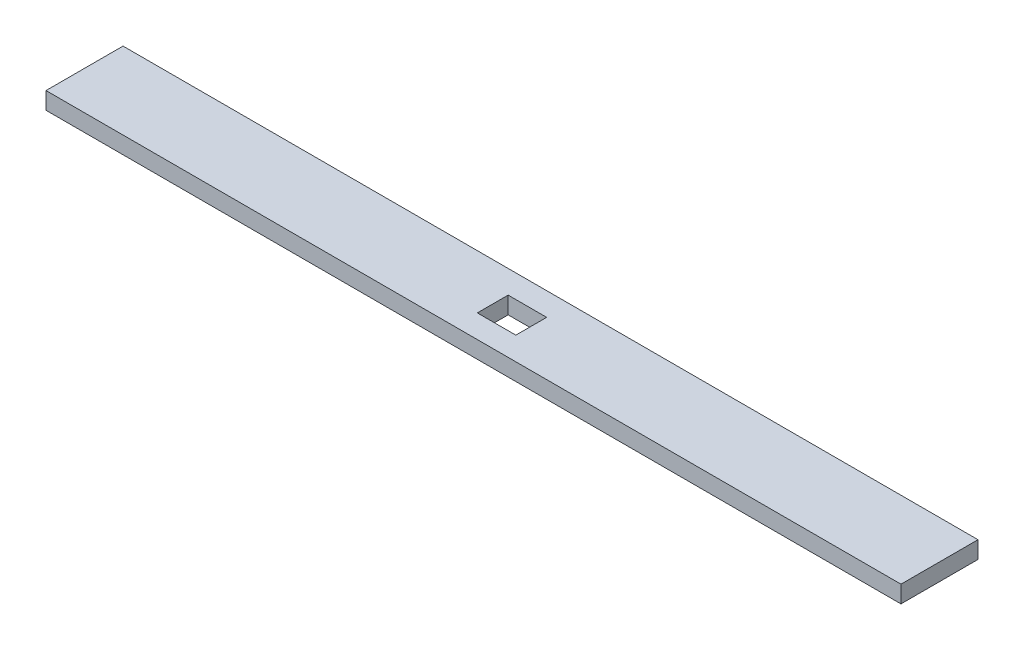
ISO-10303-21;
HEADER;
FILE_DESCRIPTION(('STEP AP214'),'2;1');
FILE_NAME('part.step','',(''),(''),'','','');
FILE_SCHEMA(('AUTOMOTIVE_DESIGN { 1 0 10303 214 1 1 1 1 }'));
ENDSEC;
DATA;
#1=APPLICATION_CONTEXT('core data for automotive mechanical design processes');
#2=APPLICATION_PROTOCOL_DEFINITION('international standard','automotive_design',2000,#1);
#3=PRODUCT_CONTEXT('',#1,'mechanical');
#4=PRODUCT('Part','Part','',(#3));
#5=PRODUCT_RELATED_PRODUCT_CATEGORY('part','',(#4));
#6=PRODUCT_DEFINITION_FORMATION('','',#4);
#7=PRODUCT_DEFINITION_CONTEXT('part definition',#1,'design');
#8=PRODUCT_DEFINITION('design','',#6,#7);
#9=PRODUCT_DEFINITION_SHAPE('','',#8);
#10=(LENGTH_UNIT() NAMED_UNIT(*) SI_UNIT(.MILLI.,.METRE.));
#11=(NAMED_UNIT(*) PLANE_ANGLE_UNIT() SI_UNIT($,.RADIAN.));
#12=(NAMED_UNIT(*) SI_UNIT($,.STERADIAN.) SOLID_ANGLE_UNIT());
#13=UNCERTAINTY_MEASURE_WITH_UNIT(LENGTH_MEASURE(1.E-05),#10,'distance_accuracy_value','');
#14=(GEOMETRIC_REPRESENTATION_CONTEXT(3) GLOBAL_UNCERTAINTY_ASSIGNED_CONTEXT((#13)) GLOBAL_UNIT_ASSIGNED_CONTEXT((#10,
#11,#12)) REPRESENTATION_CONTEXT('',''));
#15=CARTESIAN_POINT('',(0.,0.,0.));
#16=DIRECTION('',(0.,0.,1.));
#17=DIRECTION('',(1.,0.,0.));
#18=AXIS2_PLACEMENT_3D('',#15,#16,#17);
#19=CARTESIAN_POINT('',(499.5,0.,0.));
#20=DIRECTION('',(0.,0.,-1.));
#21=DIRECTION('',(-1.,0.,0.));
#22=AXIS2_PLACEMENT_3D('',#19,#20,#21);
#23=PLANE('',#22);
#24=DIRECTION('',(0.,-1.,0.));
#25=VECTOR('',#24,1.);
#26=CARTESIAN_POINT('',(0.,0.,0.));
#27=LINE('',#26,#25);
#28=CARTESIAN_POINT('',(0.,10.,0.));
#29=VERTEX_POINT('',#28);
#30=CARTESIAN_POINT('',(0.,0.,0.));
#31=VERTEX_POINT('',#30);
#32=EDGE_CURVE('E131',#29,#31,#27,.T.);
#33=ORIENTED_EDGE('',*,*,#32,.T.);
#34=DIRECTION('',(-1.,0.,0.));
#35=VECTOR('',#34,1.);
#36=CARTESIAN_POINT('',(499.5,0.,0.));
#37=LINE('',#36,#35);
#38=CARTESIAN_POINT('',(499.5,0.,0.));
#39=VERTEX_POINT('',#38);
#40=EDGE_CURVE('E11',#39,#31,#37,.T.);
#41=ORIENTED_EDGE('',*,*,#40,.F.);
#42=DIRECTION('',(0.,-1.,0.));
#43=VECTOR('',#42,1.);
#44=CARTESIAN_POINT('',(499.5,0.,0.));
#45=LINE('',#44,#43);
#46=CARTESIAN_POINT('',(499.5,10.,0.));
#47=VERTEX_POINT('',#46);
#48=EDGE_CURVE('E135',#47,#39,#45,.T.);
#49=ORIENTED_EDGE('',*,*,#48,.F.);
#50=DIRECTION('',(-1.,0.,0.));
#51=VECTOR('',#50,1.);
#52=CARTESIAN_POINT('',(499.5,10.,0.));
#53=LINE('',#52,#51);
#54=EDGE_CURVE('E145',#47,#29,#53,.T.);
#55=ORIENTED_EDGE('',*,*,#54,.T.);
#56=EDGE_LOOP('',(#33,#41,#49,#55));
#57=FACE_BOUND('',#56,.T.);
#58=ADVANCED_FACE('F34',(#57),#23,.F.);
#59=CARTESIAN_POINT('',(499.5,0.,0.));
#60=DIRECTION('',(0.,1.,0.));
#61=DIRECTION('',(0.,0.,1.));
#62=AXIS2_PLACEMENT_3D('',#59,#60,#61);
#63=PLANE('',#62);
#64=DIRECTION('',(1.,0.,0.));
#65=VECTOR('',#64,1.);
#66=CARTESIAN_POINT('',(261.,0.,-13.5));
#67=LINE('',#66,#65);
#68=CARTESIAN_POINT('',(238.5,0.,-13.5));
#69=VERTEX_POINT('',#68);
#70=CARTESIAN_POINT('',(261.,0.,-13.5));
#71=VERTEX_POINT('',#70);
#72=EDGE_CURVE('E106',#69,#71,#67,.T.);
#73=ORIENTED_EDGE('',*,*,#72,.T.);
#74=DIRECTION('',(0.,0.,-1.));
#75=VECTOR('',#74,1.);
#76=CARTESIAN_POINT('',(261.,0.,-13.5));
#77=LINE('',#76,#75);
#78=CARTESIAN_POINT('',(261.,0.,-31.5));
#79=VERTEX_POINT('',#78);
#80=EDGE_CURVE('E100',#71,#79,#77,.T.);
#81=ORIENTED_EDGE('',*,*,#80,.T.);
#82=DIRECTION('',(-1.,0.,0.));
#83=VECTOR('',#82,1.);
#84=CARTESIAN_POINT('',(261.,0.,-31.5));
#85=LINE('',#84,#83);
#86=CARTESIAN_POINT('',(238.5,0.,-31.5));
#87=VERTEX_POINT('',#86);
#88=EDGE_CURVE('E109',#79,#87,#85,.T.);
#89=ORIENTED_EDGE('',*,*,#88,.T.);
#90=DIRECTION('',(0.,0.,1.));
#91=VECTOR('',#90,1.);
#92=CARTESIAN_POINT('',(238.5,0.,-13.5));
#93=LINE('',#92,#91);
#94=EDGE_CURVE('E48',#87,#69,#93,.T.);
#95=ORIENTED_EDGE('',*,*,#94,.T.);
#96=EDGE_LOOP('',(#73,#81,#89,#95));
#97=FACE_BOUND('',#96,.T.);
#98=DIRECTION('',(0.,0.,-1.));
#99=VECTOR('',#98,1.);
#100=CARTESIAN_POINT('',(0.,0.,0.));
#101=LINE('',#100,#99);
#102=CARTESIAN_POINT('',(0.,0.,-45.));
#103=VERTEX_POINT('',#102);
#104=EDGE_CURVE('E148',#31,#103,#101,.T.);
#105=ORIENTED_EDGE('',*,*,#104,.T.);
#106=DIRECTION('',(-1.,0.,0.));
#107=VECTOR('',#106,1.);
#108=CARTESIAN_POINT('',(499.5,0.,-45.));
#109=LINE('',#108,#107);
#110=CARTESIAN_POINT('',(499.5,0.,-45.));
#111=VERTEX_POINT('',#110);
#112=EDGE_CURVE('E41',#111,#103,#109,.T.);
#113=ORIENTED_EDGE('',*,*,#112,.F.);
#114=DIRECTION('',(0.,0.,-1.));
#115=VECTOR('',#114,1.);
#116=CARTESIAN_POINT('',(499.5,0.,0.));
#117=LINE('',#116,#115);
#118=EDGE_CURVE('E138',#39,#111,#117,.T.);
#119=ORIENTED_EDGE('',*,*,#118,.F.);
#120=ORIENTED_EDGE('',*,*,#40,.T.);
#121=EDGE_LOOP('',(#105,#113,#119,#120));
#122=FACE_BOUND('',#121,.T.);
#123=ADVANCED_FACE('F113',(#97,#122),#63,.F.);
#124=CARTESIAN_POINT('',(499.5,0.,-45.));
#125=DIRECTION('',(0.,0.,1.));
#126=DIRECTION('',(1.,0.,0.));
#127=AXIS2_PLACEMENT_3D('',#124,#125,#126);
#128=PLANE('',#127);
#129=DIRECTION('',(0.,1.,0.));
#130=VECTOR('',#129,1.);
#131=CARTESIAN_POINT('',(0.,0.,-45.));
#132=LINE('',#131,#130);
#133=CARTESIAN_POINT('',(0.,10.,-45.));
#134=VERTEX_POINT('',#133);
#135=EDGE_CURVE('E150',#103,#134,#132,.T.);
#136=ORIENTED_EDGE('',*,*,#135,.T.);
#137=DIRECTION('',(-1.,0.,0.));
#138=VECTOR('',#137,1.);
#139=CARTESIAN_POINT('',(499.5,10.,-45.));
#140=LINE('',#139,#138);
#141=CARTESIAN_POINT('',(499.5,10.,-45.));
#142=VERTEX_POINT('',#141);
#143=EDGE_CURVE('E155',#142,#134,#140,.T.);
#144=ORIENTED_EDGE('',*,*,#143,.F.);
#145=DIRECTION('',(0.,1.,0.));
#146=VECTOR('',#145,1.);
#147=CARTESIAN_POINT('',(499.5,0.,-45.));
#148=LINE('',#147,#146);
#149=EDGE_CURVE('E141',#111,#142,#148,.T.);
#150=ORIENTED_EDGE('',*,*,#149,.F.);
#151=ORIENTED_EDGE('',*,*,#112,.T.);
#152=EDGE_LOOP('',(#136,#144,#150,#151));
#153=FACE_BOUND('',#152,.T.);
#154=ADVANCED_FACE('F162',(#153),#128,.F.);
#155=CARTESIAN_POINT('',(499.5,10.,0.));
#156=DIRECTION('',(0.,-1.,0.));
#157=DIRECTION('',(0.,0.,-1.));
#158=AXIS2_PLACEMENT_3D('',#155,#156,#157);
#159=PLANE('',#158);
#160=DIRECTION('',(-1.,0.,0.));
#161=VECTOR('',#160,1.);
#162=CARTESIAN_POINT('',(261.,10.,-31.5));
#163=LINE('',#162,#161);
#164=CARTESIAN_POINT('',(261.,10.,-31.5));
#165=VERTEX_POINT('',#164);
#166=CARTESIAN_POINT('',(238.5,10.,-31.5));
#167=VERTEX_POINT('',#166);
#168=EDGE_CURVE('E125',#165,#167,#163,.T.);
#169=ORIENTED_EDGE('',*,*,#168,.F.);
#170=DIRECTION('',(0.,0.,-1.));
#171=VECTOR('',#170,1.);
#172=CARTESIAN_POINT('',(261.,10.,-13.5));
#173=LINE('',#172,#171);
#174=CARTESIAN_POINT('',(261.,10.,-13.5));
#175=VERTEX_POINT('',#174);
#176=EDGE_CURVE('E56',#175,#165,#173,.T.);
#177=ORIENTED_EDGE('',*,*,#176,.F.);
#178=DIRECTION('',(1.,0.,0.));
#179=VECTOR('',#178,1.);
#180=CARTESIAN_POINT('',(261.,10.,-13.5));
#181=LINE('',#180,#179);
#182=CARTESIAN_POINT('',(238.5,10.,-13.5));
#183=VERTEX_POINT('',#182);
#184=EDGE_CURVE('E116',#183,#175,#181,.T.);
#185=ORIENTED_EDGE('',*,*,#184,.F.);
#186=DIRECTION('',(0.,0.,1.));
#187=VECTOR('',#186,1.);
#188=CARTESIAN_POINT('',(238.5,10.,-13.5));
#189=LINE('',#188,#187);
#190=EDGE_CURVE('E119',#167,#183,#189,.T.);
#191=ORIENTED_EDGE('',*,*,#190,.F.);
#192=EDGE_LOOP('',(#169,#177,#185,#191));
#193=FACE_BOUND('',#192,.T.);
#194=DIRECTION('',(0.,0.,1.));
#195=VECTOR('',#194,1.);
#196=CARTESIAN_POINT('',(0.,10.,0.));
#197=LINE('',#196,#195);
#198=EDGE_CURVE('E139',#134,#29,#197,.T.);
#199=ORIENTED_EDGE('',*,*,#198,.T.);
#200=ORIENTED_EDGE('',*,*,#54,.F.);
#201=DIRECTION('',(0.,0.,1.));
#202=VECTOR('',#201,1.);
#203=CARTESIAN_POINT('',(499.5,10.,0.));
#204=LINE('',#203,#202);
#205=EDGE_CURVE('E143',#142,#47,#204,.T.);
#206=ORIENTED_EDGE('',*,*,#205,.F.);
#207=ORIENTED_EDGE('',*,*,#143,.T.);
#208=EDGE_LOOP('',(#199,#200,#206,#207));
#209=FACE_BOUND('',#208,.T.);
#210=ADVANCED_FACE('F170',(#193,#209),#159,.F.);
#211=CARTESIAN_POINT('',(499.5,0.,0.));
#212=DIRECTION('',(-1.,0.,0.));
#213=DIRECTION('',(0.,0.,1.));
#214=AXIS2_PLACEMENT_3D('',#211,#212,#213);
#215=PLANE('',#214);
#216=ORIENTED_EDGE('',*,*,#48,.T.);
#217=ORIENTED_EDGE('',*,*,#118,.T.);
#218=ORIENTED_EDGE('',*,*,#149,.T.);
#219=ORIENTED_EDGE('',*,*,#205,.T.);
#220=EDGE_LOOP('',(#216,#217,#218,#219));
#221=FACE_BOUND('',#220,.T.);
#222=ADVANCED_FACE('F176',(#221),#215,.F.);
#223=CARTESIAN_POINT('',(0.,0.,0.));
#224=DIRECTION('',(-1.,0.,0.));
#225=DIRECTION('',(0.,0.,1.));
#226=AXIS2_PLACEMENT_3D('',#223,#224,#225);
#227=PLANE('',#226);
#228=ORIENTED_EDGE('',*,*,#32,.F.);
#229=ORIENTED_EDGE('',*,*,#198,.F.);
#230=ORIENTED_EDGE('',*,*,#135,.F.);
#231=ORIENTED_EDGE('',*,*,#104,.F.);
#232=EDGE_LOOP('',(#228,#229,#230,#231));
#233=FACE_BOUND('',#232,.T.);
#234=ADVANCED_FACE('F167',(#233),#227,.T.);
#235=CARTESIAN_POINT('',(261.,0.,-13.5));
#236=DIRECTION('',(1.,0.,0.));
#237=DIRECTION('',(0.,0.,-1.));
#238=AXIS2_PLACEMENT_3D('',#235,#236,#237);
#239=PLANE('',#238);
#240=ORIENTED_EDGE('',*,*,#176,.T.);
#241=DIRECTION('',(0.,1.,0.));
#242=VECTOR('',#241,1.);
#243=CARTESIAN_POINT('',(261.,0.,-31.5));
#244=LINE('',#243,#242);
#245=EDGE_CURVE('E96',#79,#165,#244,.T.);
#246=ORIENTED_EDGE('',*,*,#245,.F.);
#247=ORIENTED_EDGE('',*,*,#80,.F.);
#248=DIRECTION('',(0.,1.,0.));
#249=VECTOR('',#248,1.);
#250=CARTESIAN_POINT('',(261.,0.,-13.5));
#251=LINE('',#250,#249);
#252=EDGE_CURVE('E129',#71,#175,#251,.T.);
#253=ORIENTED_EDGE('',*,*,#252,.T.);
#254=EDGE_LOOP('',(#240,#246,#247,#253));
#255=FACE_BOUND('',#254,.T.);
#256=ADVANCED_FACE('F98',(#255),#239,.F.);
#257=CARTESIAN_POINT('',(261.,0.,-13.5));
#258=DIRECTION('',(0.,0.,1.));
#259=DIRECTION('',(1.,0.,0.));
#260=AXIS2_PLACEMENT_3D('',#257,#258,#259);
#261=PLANE('',#260);
#262=ORIENTED_EDGE('',*,*,#184,.T.);
#263=ORIENTED_EDGE('',*,*,#252,.F.);
#264=ORIENTED_EDGE('',*,*,#72,.F.);
#265=DIRECTION('',(0.,1.,0.));
#266=VECTOR('',#265,1.);
#267=CARTESIAN_POINT('',(238.5,0.,-13.5));
#268=LINE('',#267,#266);
#269=EDGE_CURVE('E132',#69,#183,#268,.T.);
#270=ORIENTED_EDGE('',*,*,#269,.T.);
#271=EDGE_LOOP('',(#262,#263,#264,#270));
#272=FACE_BOUND('',#271,.T.);
#273=ADVANCED_FACE('F193',(#272),#261,.F.);
#274=CARTESIAN_POINT('',(238.5,0.,-13.5));
#275=DIRECTION('',(-1.,0.,0.));
#276=DIRECTION('',(0.,0.,1.));
#277=AXIS2_PLACEMENT_3D('',#274,#275,#276);
#278=PLANE('',#277);
#279=ORIENTED_EDGE('',*,*,#190,.T.);
#280=ORIENTED_EDGE('',*,*,#269,.F.);
#281=ORIENTED_EDGE('',*,*,#94,.F.);
#282=DIRECTION('',(0.,1.,0.));
#283=VECTOR('',#282,1.);
#284=CARTESIAN_POINT('',(238.5,0.,-31.5));
#285=LINE('',#284,#283);
#286=EDGE_CURVE('E105',#87,#167,#285,.T.);
#287=ORIENTED_EDGE('',*,*,#286,.T.);
#288=EDGE_LOOP('',(#279,#280,#281,#287));
#289=FACE_BOUND('',#288,.T.);
#290=ADVANCED_FACE('F196',(#289),#278,.F.);
#291=CARTESIAN_POINT('',(261.,0.,-31.5));
#292=DIRECTION('',(0.,0.,-1.));
#293=DIRECTION('',(-1.,0.,0.));
#294=AXIS2_PLACEMENT_3D('',#291,#292,#293);
#295=PLANE('',#294);
#296=ORIENTED_EDGE('',*,*,#168,.T.);
#297=ORIENTED_EDGE('',*,*,#286,.F.);
#298=ORIENTED_EDGE('',*,*,#88,.F.);
#299=ORIENTED_EDGE('',*,*,#245,.T.);
#300=EDGE_LOOP('',(#296,#297,#298,#299));
#301=FACE_BOUND('',#300,.T.);
#302=ADVANCED_FACE('F110',(#301),#295,.F.);
#303=CLOSED_SHELL('',(#58,#123,#154,#210,#222,#234,#256,#273,#290,#302));
#304=MANIFOLD_SOLID_BREP('B2',#303);
#305=ADVANCED_BREP_SHAPE_REPRESENTATION('',(#18,#304),#14);
#306=SHAPE_DEFINITION_REPRESENTATION(#9,#305);
ENDSEC;
END-ISO-10303-21;
